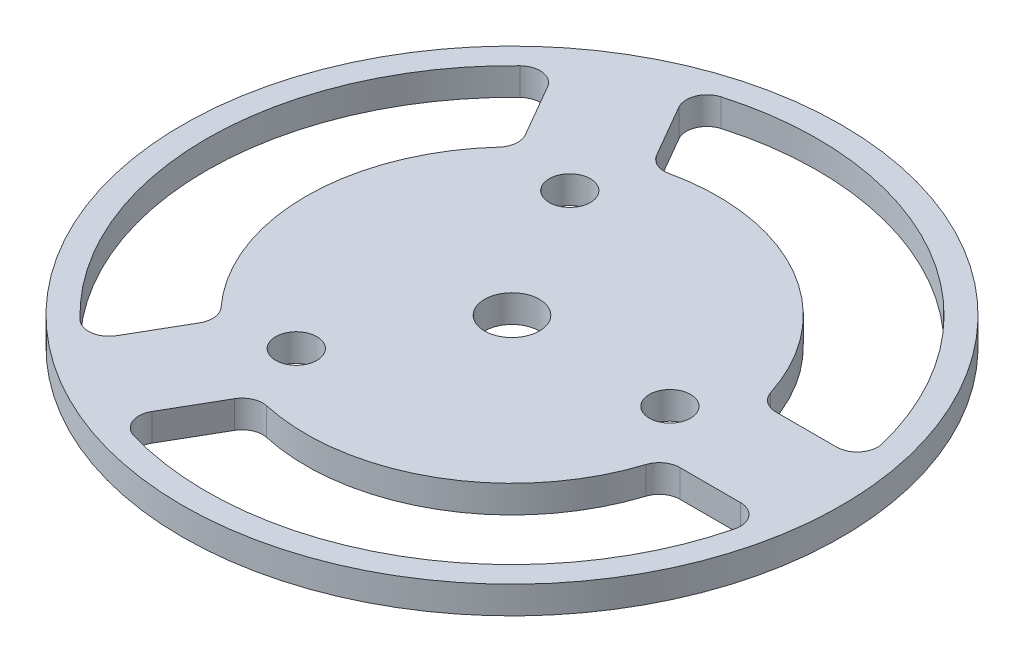
ISO-10303-21;
HEADER;
FILE_DESCRIPTION(('STEP AP214'),'2;1');
FILE_NAME('part.step','',(''),(''),'','','');
FILE_SCHEMA(('AUTOMOTIVE_DESIGN { 1 0 10303 214 1 1 1 1 }'));
ENDSEC;
DATA;
#1=APPLICATION_CONTEXT('core data for automotive mechanical design processes');
#2=APPLICATION_PROTOCOL_DEFINITION('international standard','automotive_design',2000,#1);
#3=PRODUCT_CONTEXT('',#1,'mechanical');
#4=PRODUCT('Part','Part','',(#3));
#5=PRODUCT_RELATED_PRODUCT_CATEGORY('part','',(#4));
#6=PRODUCT_DEFINITION_FORMATION('','',#4);
#7=PRODUCT_DEFINITION_CONTEXT('part definition',#1,'design');
#8=PRODUCT_DEFINITION('design','',#6,#7);
#9=PRODUCT_DEFINITION_SHAPE('','',#8);
#10=(LENGTH_UNIT() NAMED_UNIT(*) SI_UNIT(.MILLI.,.METRE.));
#11=(NAMED_UNIT(*) PLANE_ANGLE_UNIT() SI_UNIT($,.RADIAN.));
#12=(NAMED_UNIT(*) SI_UNIT($,.STERADIAN.) SOLID_ANGLE_UNIT());
#13=UNCERTAINTY_MEASURE_WITH_UNIT(LENGTH_MEASURE(1.E-05),#10,'distance_accuracy_value','');
#14=(GEOMETRIC_REPRESENTATION_CONTEXT(3) GLOBAL_UNCERTAINTY_ASSIGNED_CONTEXT((#13)) GLOBAL_UNIT_ASSIGNED_CONTEXT((#10,
#11,#12)) REPRESENTATION_CONTEXT('',''));
#15=CARTESIAN_POINT('',(0.,0.,0.));
#16=DIRECTION('',(0.,0.,1.));
#17=DIRECTION('',(1.,0.,0.));
#18=AXIS2_PLACEMENT_3D('',#15,#16,#17);
#19=CARTESIAN_POINT('',(0.,2.,0.));
#20=DIRECTION('',(0.,1.,0.));
#21=DIRECTION('',(0.,0.,1.));
#22=AXIS2_PLACEMENT_3D('',#19,#20,#21);
#23=PLANE('',#22);
#24=CARTESIAN_POINT('',(0.,2.,0.));
#25=DIRECTION('',(0.,1.,0.));
#26=DIRECTION('',(0.,0.,1.));
#27=AXIS2_PLACEMENT_3D('',#24,#25,#26);
#28=CIRCLE('',#27,22.25);
#29=CARTESIAN_POINT('',(21.5943835085545,2.,-5.36144578313253));
#30=VERTEX_POINT('',#29);
#31=CARTESIAN_POINT('',(-6.15404350507153,2.,-21.3820075890382));
#32=VERTEX_POINT('',#31);
#33=EDGE_CURVE('E482',#30,#32,#28,.T.);
#34=ORIENTED_EDGE('',*,*,#33,.F.);
#35=CARTESIAN_POINT('',(20.1385823731463,2.,-5.));
#36=DIRECTION('',(0.,1.,0.));
#37=DIRECTION('',(0.,0.,1.));
#38=AXIS2_PLACEMENT_3D('',#35,#36,#37);
#39=CIRCLE('',#38,1.5);
#40=CARTESIAN_POINT('',(20.1385823731463,2.,-3.5));
#41=VERTEX_POINT('',#40);
#42=EDGE_CURVE('E373',#30,#41,#39,.F.);
#43=ORIENTED_EDGE('',*,*,#42,.T.);
#44=DIRECTION('',(1.,0.,0.));
#45=VECTOR('',#44,1.);
#46=CARTESIAN_POINT('',(21.9729947890587,2.,-3.5));
#47=LINE('',#46,#45);
#48=CARTESIAN_POINT('',(15.7241851935164,2.,-3.5));
#49=VERTEX_POINT('',#48);
#50=EDGE_CURVE('E471',#49,#41,#47,.T.);
#51=ORIENTED_EDGE('',*,*,#50,.F.);
#52=CARTESIAN_POINT('',(15.7241851935164,2.,-5.));
#53=DIRECTION('',(0.,1.,0.));
#54=DIRECTION('',(0.,0.,1.));
#55=AXIS2_PLACEMENT_3D('',#52,#53,#54);
#56=CIRCLE('',#55,1.5);
#57=CARTESIAN_POINT('',(14.2947138122876,2.,-4.54545454545454));
#58=VERTEX_POINT('',#57);
#59=EDGE_CURVE('E391',#49,#58,#56,.F.);
#60=ORIENTED_EDGE('',*,*,#59,.T.);
#61=CARTESIAN_POINT('',(0.,2.,0.));
#62=DIRECTION('',(0.,-1.,0.));
#63=DIRECTION('',(0.,0.,1.));
#64=AXIS2_PLACEMENT_3D('',#61,#62,#63);
#65=CIRCLE('',#64,15.);
#66=CARTESIAN_POINT('',(-3.21087779803273,2.,-14.6523125739967));
#67=VERTEX_POINT('',#66);
#68=EDGE_CURVE('E490',#67,#58,#65,.T.);
#69=ORIENTED_EDGE('',*,*,#68,.F.);
#70=CARTESIAN_POINT('',(-3.53196557783601,2.,-16.1175438313963));
#71=DIRECTION('',(0.,1.,0.));
#72=DIRECTION('',(0.,0.,1.));
#73=AXIS2_PLACEMENT_3D('',#70,#71,#72);
#74=CIRCLE('',#73,1.5);
#75=CARTESIAN_POINT('',(-4.83100368351267,2.,-15.3675438313963));
#76=VERTEX_POINT('',#75);
#77=EDGE_CURVE('E385',#67,#76,#74,.F.);
#78=ORIENTED_EDGE('',*,*,#77,.T.);
#79=DIRECTION('',(0.5,0.,0.866025403784438));
#80=VECTOR('',#79,1.);
#81=CARTESIAN_POINT('',(-7.95540848128382,2.,-20.7791716845479));
#82=LINE('',#81,#80);
#83=CARTESIAN_POINT('',(-7.03820227332764,2.,-19.1905239313502));
#84=VERTEX_POINT('',#83);
#85=EDGE_CURVE('E486',#84,#76,#82,.T.);
#86=ORIENTED_EDGE('',*,*,#85,.F.);
#87=CARTESIAN_POINT('',(-5.73916416765098,2.,-19.9405239313502));
#88=DIRECTION('',(0.,1.,0.));
#89=DIRECTION('',(0.,0.,1.));
#90=AXIS2_PLACEMENT_3D('',#87,#88,#89);
#91=CIRCLE('',#90,1.5);
#92=EDGE_CURVE('E361',#84,#32,#91,.F.);
#93=ORIENTED_EDGE('',*,*,#92,.T.);
#94=EDGE_LOOP('',(#34,#43,#51,#60,#69,#78,#86,#93));
#95=FACE_BOUND('',#94,.T.);
#96=CARTESIAN_POINT('',(0.,2.,0.));
#97=DIRECTION('',(0.,1.,0.));
#98=DIRECTION('',(0.,0.,1.));
#99=AXIS2_PLACEMENT_3D('',#96,#97,#98);
#100=CIRCLE('',#99,22.25);
#101=CARTESIAN_POINT('',(-15.440340003483,2.,-16.0205618059057));
#102=VERTEX_POINT('',#101);
#103=CARTESIAN_POINT('',(-15.440340003483,2.,16.0205618059057));
#104=VERTEX_POINT('',#103);
#105=EDGE_CURVE('E424',#102,#104,#100,.T.);
#106=ORIENTED_EDGE('',*,*,#105,.F.);
#107=CARTESIAN_POINT('',(-14.3994182054954,2.,-14.9405239313502));
#108=DIRECTION('',(0.,1.,0.));
#109=DIRECTION('',(0.,0.,1.));
#110=AXIS2_PLACEMENT_3D('',#107,#108,#109);
#111=CIRCLE('',#110,1.5);
#112=CARTESIAN_POINT('',(-13.1003800998187,2.,-15.6905239313502));
#113=VERTEX_POINT('',#112);
#114=EDGE_CURVE('E48',#102,#113,#111,.F.);
#115=ORIENTED_EDGE('',*,*,#114,.T.);
#116=DIRECTION('',(-0.499999999999998,0.,-0.86602540378444));
#117=VECTOR('',#116,1.);
#118=CARTESIAN_POINT('',(-14.0175863077749,2.,-17.2791716845479));
#119=LINE('',#118,#117);
#120=CARTESIAN_POINT('',(-10.8931815100037,2.,-11.8675438313963));
#121=VERTEX_POINT('',#120);
#122=EDGE_CURVE('E422',#121,#113,#119,.T.);
#123=ORIENTED_EDGE('',*,*,#122,.F.);
#124=CARTESIAN_POINT('',(-12.1922196156804,2.,-11.1175438313963));
#125=DIRECTION('',(0.,1.,0.));
#126=DIRECTION('',(0.,0.,1.));
#127=AXIS2_PLACEMENT_3D('',#124,#125,#126);
#128=CIRCLE('',#127,1.5);
#129=CARTESIAN_POINT('',(-11.0838360142549,2.,-10.1068580285421));
#130=VERTEX_POINT('',#129);
#131=EDGE_CURVE('E414',#121,#130,#128,.F.);
#132=ORIENTED_EDGE('',*,*,#131,.T.);
#133=CARTESIAN_POINT('',(0.,2.,0.));
#134=DIRECTION('',(0.,-1.,0.));
#135=DIRECTION('',(0.,0.,1.));
#136=AXIS2_PLACEMENT_3D('',#133,#134,#135);
#137=CIRCLE('',#136,15.);
#138=CARTESIAN_POINT('',(-11.0838360142549,2.,10.1068580285421));
#139=VERTEX_POINT('',#138);
#140=EDGE_CURVE('E431',#139,#130,#137,.T.);
#141=ORIENTED_EDGE('',*,*,#140,.F.);
#142=CARTESIAN_POINT('',(-12.1922196156804,2.,11.1175438313963));
#143=DIRECTION('',(0.,1.,0.));
#144=DIRECTION('',(0.,0.,1.));
#145=AXIS2_PLACEMENT_3D('',#142,#143,#144);
#146=CIRCLE('',#145,1.5);
#147=CARTESIAN_POINT('',(-10.8931815100037,2.,11.8675438313963));
#148=VERTEX_POINT('',#147);
#149=EDGE_CURVE('E408',#139,#148,#146,.F.);
#150=ORIENTED_EDGE('',*,*,#149,.T.);
#151=DIRECTION('',(0.499999999999999,0.,-0.866025403784439));
#152=VECTOR('',#151,1.);
#153=CARTESIAN_POINT('',(-14.0175863077749,2.,17.2791716845479));
#154=LINE('',#153,#152);
#155=CARTESIAN_POINT('',(-13.1003800998187,2.,15.6905239313502));
#156=VERTEX_POINT('',#155);
#157=EDGE_CURVE('E458',#156,#148,#154,.T.);
#158=ORIENTED_EDGE('',*,*,#157,.F.);
#159=CARTESIAN_POINT('',(-14.3994182054954,2.,14.9405239313502));
#160=DIRECTION('',(0.,1.,0.));
#161=DIRECTION('',(0.,0.,1.));
#162=AXIS2_PLACEMENT_3D('',#159,#160,#161);
#163=CIRCLE('',#162,1.5);
#164=EDGE_CURVE('E379',#156,#104,#163,.F.);
#165=ORIENTED_EDGE('',*,*,#164,.T.);
#166=EDGE_LOOP('',(#106,#115,#123,#132,#141,#150,#158,#165));
#167=FACE_BOUND('',#166,.T.);
#168=CARTESIAN_POINT('',(0.,2.,0.));
#169=DIRECTION('',(0.,1.,0.));
#170=DIRECTION('',(0.,0.,1.));
#171=AXIS2_PLACEMENT_3D('',#168,#169,#170);
#172=CIRCLE('',#171,22.25);
#173=CARTESIAN_POINT('',(-6.15404350507152,2.,21.3820075890382));
#174=VERTEX_POINT('',#173);
#175=CARTESIAN_POINT('',(21.5943835085545,2.,5.36144578313253));
#176=VERTEX_POINT('',#175);
#177=EDGE_CURVE('E455',#174,#176,#172,.T.);
#178=ORIENTED_EDGE('',*,*,#177,.F.);
#179=CARTESIAN_POINT('',(-5.73916416765096,2.,19.9405239313502));
#180=DIRECTION('',(0.,1.,0.));
#181=DIRECTION('',(0.,0.,1.));
#182=AXIS2_PLACEMENT_3D('',#179,#180,#181);
#183=CIRCLE('',#182,1.5);
#184=CARTESIAN_POINT('',(-7.03820227332762,2.,19.1905239313502));
#185=VERTEX_POINT('',#184);
#186=EDGE_CURVE('E230',#174,#185,#183,.F.);
#187=ORIENTED_EDGE('',*,*,#186,.T.);
#188=DIRECTION('',(-0.5,0.,0.866025403784439));
#189=VECTOR('',#188,1.);
#190=CARTESIAN_POINT('',(-7.9554084812838,2.,20.7791716845479));
#191=LINE('',#190,#189);
#192=CARTESIAN_POINT('',(-4.83100368351266,2.,15.3675438313963));
#193=VERTEX_POINT('',#192);
#194=EDGE_CURVE('E220',#193,#185,#191,.T.);
#195=ORIENTED_EDGE('',*,*,#194,.F.);
#196=CARTESIAN_POINT('',(-3.531965577836,2.,16.1175438313963));
#197=DIRECTION('',(0.,1.,0.));
#198=DIRECTION('',(0.,0.,1.));
#199=AXIS2_PLACEMENT_3D('',#196,#197,#198);
#200=CIRCLE('',#199,1.5);
#201=CARTESIAN_POINT('',(-3.21087779803272,2.,14.6523125739967));
#202=VERTEX_POINT('',#201);
#203=EDGE_CURVE('E202',#193,#202,#200,.F.);
#204=ORIENTED_EDGE('',*,*,#203,.T.);
#205=CARTESIAN_POINT('',(0.,2.,0.));
#206=DIRECTION('',(0.,-1.,0.));
#207=DIRECTION('',(0.,0.,1.));
#208=AXIS2_PLACEMENT_3D('',#205,#206,#207);
#209=CIRCLE('',#208,15.);
#210=CARTESIAN_POINT('',(14.2947138122876,2.,4.54545454545454));
#211=VERTEX_POINT('',#210);
#212=EDGE_CURVE('E233',#211,#202,#209,.T.);
#213=ORIENTED_EDGE('',*,*,#212,.F.);
#214=CARTESIAN_POINT('',(15.7241851935164,2.,5.));
#215=DIRECTION('',(0.,1.,0.));
#216=DIRECTION('',(0.,0.,1.));
#217=AXIS2_PLACEMENT_3D('',#214,#215,#216);
#218=CIRCLE('',#217,1.5);
#219=CARTESIAN_POINT('',(15.7241851935164,2.,3.5));
#220=VERTEX_POINT('',#219);
#221=EDGE_CURVE('E367',#211,#220,#218,.F.);
#222=ORIENTED_EDGE('',*,*,#221,.T.);
#223=DIRECTION('',(-1.,0.,0.));
#224=VECTOR('',#223,1.);
#225=CARTESIAN_POINT('',(21.9729947890587,2.,3.5));
#226=LINE('',#225,#224);
#227=CARTESIAN_POINT('',(20.1385823731463,2.,3.5));
#228=VERTEX_POINT('',#227);
#229=EDGE_CURVE('E240',#228,#220,#226,.T.);
#230=ORIENTED_EDGE('',*,*,#229,.F.);
#231=CARTESIAN_POINT('',(20.1385823731463,2.,5.));
#232=DIRECTION('',(0.,1.,0.));
#233=DIRECTION('',(0.,0.,1.));
#234=AXIS2_PLACEMENT_3D('',#231,#232,#233);
#235=CIRCLE('',#234,1.5);
#236=EDGE_CURVE('E402',#228,#176,#235,.F.);
#237=ORIENTED_EDGE('',*,*,#236,.T.);
#238=EDGE_LOOP('',(#178,#187,#195,#204,#213,#222,#230,#237));
#239=FACE_BOUND('',#238,.T.);
#240=CARTESIAN_POINT('',(-5.75000000000005,2.,9.95929214352102));
#241=DIRECTION('',(0.,1.,0.));
#242=DIRECTION('',(0.,0.,1.));
#243=AXIS2_PLACEMENT_3D('',#240,#241,#242);
#244=CIRCLE('',#243,1.5);
#245=CARTESIAN_POINT('',(-5.75000000000005,2.,11.459292143521));
#246=VERTEX_POINT('',#245);
#247=EDGE_CURVE('E253',#246,#246,#244,.T.);
#248=ORIENTED_EDGE('',*,*,#247,.F.);
#249=EDGE_LOOP('',(#248));
#250=FACE_BOUND('',#249,.T.);
#251=CARTESIAN_POINT('',(0.,2.,0.));
#252=DIRECTION('',(0.,1.,0.));
#253=DIRECTION('',(0.,0.,1.));
#254=AXIS2_PLACEMENT_3D('',#251,#252,#253);
#255=CIRCLE('',#254,2.);
#256=CARTESIAN_POINT('',(0.,2.,2.));
#257=VERTEX_POINT('',#256);
#258=EDGE_CURVE('E269',#257,#257,#255,.T.);
#259=ORIENTED_EDGE('',*,*,#258,.F.);
#260=EDGE_LOOP('',(#259));
#261=FACE_BOUND('',#260,.T.);
#262=CARTESIAN_POINT('',(0.,2.,0.));
#263=DIRECTION('',(0.,1.,0.));
#264=DIRECTION('',(0.,0.,1.));
#265=AXIS2_PLACEMENT_3D('',#262,#263,#264);
#266=CIRCLE('',#265,24.);
#267=CARTESIAN_POINT('',(0.,2.,24.));
#268=VERTEX_POINT('',#267);
#269=EDGE_CURVE('E277',#268,#268,#266,.T.);
#270=ORIENTED_EDGE('',*,*,#269,.T.);
#271=EDGE_LOOP('',(#270));
#272=FACE_BOUND('',#271,.T.);
#273=CARTESIAN_POINT('',(11.5,2.,0.));
#274=DIRECTION('',(0.,1.,0.));
#275=DIRECTION('',(0.,0.,1.));
#276=AXIS2_PLACEMENT_3D('',#273,#274,#275);
#277=CIRCLE('',#276,1.5);
#278=CARTESIAN_POINT('',(11.5,2.,1.5));
#279=VERTEX_POINT('',#278);
#280=EDGE_CURVE('E261',#279,#279,#277,.T.);
#281=ORIENTED_EDGE('',*,*,#280,.F.);
#282=EDGE_LOOP('',(#281));
#283=FACE_BOUND('',#282,.T.);
#284=CARTESIAN_POINT('',(-5.74999999999991,2.,-9.95929214352109));
#285=DIRECTION('',(0.,1.,0.));
#286=DIRECTION('',(0.,0.,1.));
#287=AXIS2_PLACEMENT_3D('',#284,#285,#286);
#288=CIRCLE('',#287,1.5);
#289=CARTESIAN_POINT('',(-5.74999999999991,2.,-8.4592921435211));
#290=VERTEX_POINT('',#289);
#291=EDGE_CURVE('E244',#290,#290,#288,.T.);
#292=ORIENTED_EDGE('',*,*,#291,.F.);
#293=EDGE_LOOP('',(#292));
#294=FACE_BOUND('',#293,.T.);
#295=ADVANCED_FACE('F39',(#95,#167,#239,#250,#261,#272,#283,#294),#23,.T.);
#296=CARTESIAN_POINT('',(0.,0.,0.));
#297=DIRECTION('',(0.,1.,0.));
#298=DIRECTION('',(0.,0.,1.));
#299=AXIS2_PLACEMENT_3D('',#296,#297,#298);
#300=PLANE('',#299);
#301=CARTESIAN_POINT('',(0.,0.,0.));
#302=DIRECTION('',(0.,-1.,0.));
#303=DIRECTION('',(0.,0.,1.));
#304=AXIS2_PLACEMENT_3D('',#301,#302,#303);
#305=CIRCLE('',#304,15.);
#306=CARTESIAN_POINT('',(-3.21087779803273,0.,-14.6523125739967));
#307=VERTEX_POINT('',#306);
#308=CARTESIAN_POINT('',(14.2947138122876,0.,-4.54545454545454));
#309=VERTEX_POINT('',#308);
#310=EDGE_CURVE('E475',#307,#309,#305,.T.);
#311=ORIENTED_EDGE('',*,*,#310,.T.);
#312=CARTESIAN_POINT('',(15.7241851935164,0.,-5.));
#313=DIRECTION('',(0.,1.,0.));
#314=DIRECTION('',(0.,0.,1.));
#315=AXIS2_PLACEMENT_3D('',#312,#313,#314);
#316=CIRCLE('',#315,1.5);
#317=CARTESIAN_POINT('',(15.7241851935164,0.,-3.5));
#318=VERTEX_POINT('',#317);
#319=EDGE_CURVE('E394',#309,#318,#316,.T.);
#320=ORIENTED_EDGE('',*,*,#319,.T.);
#321=DIRECTION('',(1.,0.,0.));
#322=VECTOR('',#321,1.);
#323=CARTESIAN_POINT('',(21.9729947890587,0.,-3.5));
#324=LINE('',#323,#322);
#325=CARTESIAN_POINT('',(20.1385823731463,0.,-3.5));
#326=VERTEX_POINT('',#325);
#327=EDGE_CURVE('E459',#318,#326,#324,.T.);
#328=ORIENTED_EDGE('',*,*,#327,.T.);
#329=CARTESIAN_POINT('',(20.1385823731463,0.,-5.));
#330=DIRECTION('',(0.,1.,0.));
#331=DIRECTION('',(0.,0.,1.));
#332=AXIS2_PLACEMENT_3D('',#329,#330,#331);
#333=CIRCLE('',#332,1.5);
#334=CARTESIAN_POINT('',(21.5943835085545,0.,-5.36144578313253));
#335=VERTEX_POINT('',#334);
#336=EDGE_CURVE('E376',#326,#335,#333,.T.);
#337=ORIENTED_EDGE('',*,*,#336,.T.);
#338=CARTESIAN_POINT('',(0.,0.,0.));
#339=DIRECTION('',(0.,1.,0.));
#340=DIRECTION('',(0.,0.,1.));
#341=AXIS2_PLACEMENT_3D('',#338,#339,#340);
#342=CIRCLE('',#341,22.25);
#343=CARTESIAN_POINT('',(-6.15404350507153,0.,-21.3820075890382));
#344=VERTEX_POINT('',#343);
#345=EDGE_CURVE('E466',#335,#344,#342,.T.);
#346=ORIENTED_EDGE('',*,*,#345,.T.);
#347=CARTESIAN_POINT('',(-5.73916416765098,0.,-19.9405239313502));
#348=DIRECTION('',(0.,1.,0.));
#349=DIRECTION('',(0.,0.,1.));
#350=AXIS2_PLACEMENT_3D('',#347,#348,#349);
#351=CIRCLE('',#350,1.5);
#352=CARTESIAN_POINT('',(-7.03820227332764,0.,-19.1905239313502));
#353=VERTEX_POINT('',#352);
#354=EDGE_CURVE('E364',#344,#353,#351,.T.);
#355=ORIENTED_EDGE('',*,*,#354,.T.);
#356=DIRECTION('',(0.5,0.,0.866025403784438));
#357=VECTOR('',#356,1.);
#358=CARTESIAN_POINT('',(-7.95540848128382,0.,-20.7791716845479));
#359=LINE('',#358,#357);
#360=CARTESIAN_POINT('',(-4.83100368351267,0.,-15.3675438313963));
#361=VERTEX_POINT('',#360);
#362=EDGE_CURVE('E470',#353,#361,#359,.T.);
#363=ORIENTED_EDGE('',*,*,#362,.T.);
#364=CARTESIAN_POINT('',(-3.53196557783601,0.,-16.1175438313963));
#365=DIRECTION('',(0.,1.,0.));
#366=DIRECTION('',(0.,0.,1.));
#367=AXIS2_PLACEMENT_3D('',#364,#365,#366);
#368=CIRCLE('',#367,1.5);
#369=EDGE_CURVE('E388',#361,#307,#368,.T.);
#370=ORIENTED_EDGE('',*,*,#369,.T.);
#371=EDGE_LOOP('',(#311,#320,#328,#337,#346,#355,#363,#370));
#372=FACE_BOUND('',#371,.T.);
#373=CARTESIAN_POINT('',(0.,0.,0.));
#374=DIRECTION('',(0.,-1.,0.));
#375=DIRECTION('',(0.,0.,1.));
#376=AXIS2_PLACEMENT_3D('',#373,#374,#375);
#377=CIRCLE('',#376,15.);
#378=CARTESIAN_POINT('',(-11.0838360142549,0.,10.1068580285421));
#379=VERTEX_POINT('',#378);
#380=CARTESIAN_POINT('',(-11.0838360142549,0.,-10.1068580285421));
#381=VERTEX_POINT('',#380);
#382=EDGE_CURVE('E448',#379,#381,#377,.T.);
#383=ORIENTED_EDGE('',*,*,#382,.T.);
#384=CARTESIAN_POINT('',(-12.1922196156804,0.,-11.1175438313963));
#385=DIRECTION('',(0.,1.,0.));
#386=DIRECTION('',(0.,0.,1.));
#387=AXIS2_PLACEMENT_3D('',#384,#385,#386);
#388=CIRCLE('',#387,1.5);
#389=CARTESIAN_POINT('',(-10.8931815100037,0.,-11.8675438313963));
#390=VERTEX_POINT('',#389);
#391=EDGE_CURVE('E62',#381,#390,#388,.T.);
#392=ORIENTED_EDGE('',*,*,#391,.T.);
#393=DIRECTION('',(-0.499999999999998,0.,-0.86602540378444));
#394=VECTOR('',#393,1.);
#395=CARTESIAN_POINT('',(-14.0175863077749,0.,-17.2791716845479));
#396=LINE('',#395,#394);
#397=CARTESIAN_POINT('',(-13.1003800998187,0.,-15.6905239313502));
#398=VERTEX_POINT('',#397);
#399=EDGE_CURVE('E439',#390,#398,#396,.T.);
#400=ORIENTED_EDGE('',*,*,#399,.T.);
#401=CARTESIAN_POINT('',(-14.3994182054954,0.,-14.9405239313502));
#402=DIRECTION('',(0.,1.,0.));
#403=DIRECTION('',(0.,0.,1.));
#404=AXIS2_PLACEMENT_3D('',#401,#402,#403);
#405=CIRCLE('',#404,1.5);
#406=CARTESIAN_POINT('',(-15.440340003483,0.,-16.0205618059057));
#407=VERTEX_POINT('',#406);
#408=EDGE_CURVE('E11',#398,#407,#405,.T.);
#409=ORIENTED_EDGE('',*,*,#408,.T.);
#410=CARTESIAN_POINT('',(0.,0.,0.));
#411=DIRECTION('',(0.,1.,0.));
#412=DIRECTION('',(0.,0.,1.));
#413=AXIS2_PLACEMENT_3D('',#410,#411,#412);
#414=CIRCLE('',#413,22.25);
#415=CARTESIAN_POINT('',(-15.440340003483,0.,16.0205618059057));
#416=VERTEX_POINT('',#415);
#417=EDGE_CURVE('E430',#407,#416,#414,.T.);
#418=ORIENTED_EDGE('',*,*,#417,.T.);
#419=CARTESIAN_POINT('',(-14.3994182054954,0.,14.9405239313502));
#420=DIRECTION('',(0.,1.,0.));
#421=DIRECTION('',(0.,0.,1.));
#422=AXIS2_PLACEMENT_3D('',#419,#420,#421);
#423=CIRCLE('',#422,1.5);
#424=CARTESIAN_POINT('',(-13.1003800998187,0.,15.6905239313502));
#425=VERTEX_POINT('',#424);
#426=EDGE_CURVE('E382',#416,#425,#423,.T.);
#427=ORIENTED_EDGE('',*,*,#426,.T.);
#428=DIRECTION('',(0.499999999999999,0.,-0.866025403784439));
#429=VECTOR('',#428,1.);
#430=CARTESIAN_POINT('',(-14.0175863077749,0.,17.2791716845479));
#431=LINE('',#430,#429);
#432=CARTESIAN_POINT('',(-10.8931815100037,0.,11.8675438313963));
#433=VERTEX_POINT('',#432);
#434=EDGE_CURVE('E444',#425,#433,#431,.T.);
#435=ORIENTED_EDGE('',*,*,#434,.T.);
#436=CARTESIAN_POINT('',(-12.1922196156804,0.,11.1175438313963));
#437=DIRECTION('',(0.,1.,0.));
#438=DIRECTION('',(0.,0.,1.));
#439=AXIS2_PLACEMENT_3D('',#436,#437,#438);
#440=CIRCLE('',#439,1.5);
#441=EDGE_CURVE('E411',#433,#379,#440,.T.);
#442=ORIENTED_EDGE('',*,*,#441,.T.);
#443=EDGE_LOOP('',(#383,#392,#400,#409,#418,#427,#435,#442));
#444=FACE_BOUND('',#443,.T.);
#445=CARTESIAN_POINT('',(0.,0.,0.));
#446=DIRECTION('',(0.,-1.,0.));
#447=DIRECTION('',(0.,0.,1.));
#448=AXIS2_PLACEMENT_3D('',#445,#446,#447);
#449=CIRCLE('',#448,15.);
#450=CARTESIAN_POINT('',(14.2947138122876,0.,4.54545454545454));
#451=VERTEX_POINT('',#450);
#452=CARTESIAN_POINT('',(-3.21087779803272,0.,14.6523125739967));
#453=VERTEX_POINT('',#452);
#454=EDGE_CURVE('E500',#451,#453,#449,.T.);
#455=ORIENTED_EDGE('',*,*,#454,.T.);
#456=CARTESIAN_POINT('',(-3.531965577836,0.,16.1175438313963));
#457=DIRECTION('',(0.,1.,0.));
#458=DIRECTION('',(0.,0.,1.));
#459=AXIS2_PLACEMENT_3D('',#456,#457,#458);
#460=CIRCLE('',#459,1.5);
#461=CARTESIAN_POINT('',(-4.83100368351266,0.,15.3675438313963));
#462=VERTEX_POINT('',#461);
#463=EDGE_CURVE('E213',#453,#462,#460,.T.);
#464=ORIENTED_EDGE('',*,*,#463,.T.);
#465=DIRECTION('',(-0.5,0.,0.866025403784439));
#466=VECTOR('',#465,1.);
#467=CARTESIAN_POINT('',(-7.9554084812838,0.,20.7791716845479));
#468=LINE('',#467,#466);
#469=CARTESIAN_POINT('',(-7.03820227332762,0.,19.1905239313502));
#470=VERTEX_POINT('',#469);
#471=EDGE_CURVE('E223',#462,#470,#468,.T.);
#472=ORIENTED_EDGE('',*,*,#471,.T.);
#473=CARTESIAN_POINT('',(-5.73916416765096,0.,19.9405239313502));
#474=DIRECTION('',(0.,1.,0.));
#475=DIRECTION('',(0.,0.,1.));
#476=AXIS2_PLACEMENT_3D('',#473,#474,#475);
#477=CIRCLE('',#476,1.5);
#478=CARTESIAN_POINT('',(-6.15404350507152,0.,21.3820075890382));
#479=VERTEX_POINT('',#478);
#480=EDGE_CURVE('E399',#470,#479,#477,.T.);
#481=ORIENTED_EDGE('',*,*,#480,.T.);
#482=CARTESIAN_POINT('',(0.,0.,0.));
#483=DIRECTION('',(0.,1.,0.));
#484=DIRECTION('',(0.,0.,1.));
#485=AXIS2_PLACEMENT_3D('',#482,#483,#484);
#486=CIRCLE('',#485,22.25);
#487=CARTESIAN_POINT('',(21.5943835085545,0.,5.36144578313253));
#488=VERTEX_POINT('',#487);
#489=EDGE_CURVE('E232',#479,#488,#486,.T.);
#490=ORIENTED_EDGE('',*,*,#489,.T.);
#491=CARTESIAN_POINT('',(20.1385823731463,0.,5.));
#492=DIRECTION('',(0.,1.,0.));
#493=DIRECTION('',(0.,0.,1.));
#494=AXIS2_PLACEMENT_3D('',#491,#492,#493);
#495=CIRCLE('',#494,1.5);
#496=CARTESIAN_POINT('',(20.1385823731463,0.,3.5));
#497=VERTEX_POINT('',#496);
#498=EDGE_CURVE('E405',#488,#497,#495,.T.);
#499=ORIENTED_EDGE('',*,*,#498,.T.);
#500=DIRECTION('',(-1.,0.,0.));
#501=VECTOR('',#500,1.);
#502=CARTESIAN_POINT('',(21.9729947890587,0.,3.5));
#503=LINE('',#502,#501);
#504=CARTESIAN_POINT('',(15.7241851935164,0.,3.5));
#505=VERTEX_POINT('',#504);
#506=EDGE_CURVE('E238',#497,#505,#503,.T.);
#507=ORIENTED_EDGE('',*,*,#506,.T.);
#508=CARTESIAN_POINT('',(15.7241851935164,0.,5.));
#509=DIRECTION('',(0.,1.,0.));
#510=DIRECTION('',(0.,0.,1.));
#511=AXIS2_PLACEMENT_3D('',#508,#509,#510);
#512=CIRCLE('',#511,1.5);
#513=EDGE_CURVE('E370',#505,#451,#512,.T.);
#514=ORIENTED_EDGE('',*,*,#513,.T.);
#515=EDGE_LOOP('',(#455,#464,#472,#481,#490,#499,#507,#514));
#516=FACE_BOUND('',#515,.T.);
#517=CARTESIAN_POINT('',(0.,0.,0.));
#518=DIRECTION('',(0.,1.,0.));
#519=DIRECTION('',(0.,0.,1.));
#520=AXIS2_PLACEMENT_3D('',#517,#518,#519);
#521=CIRCLE('',#520,24.);
#522=CARTESIAN_POINT('',(0.,0.,24.));
#523=VERTEX_POINT('',#522);
#524=EDGE_CURVE('E273',#523,#523,#521,.T.);
#525=ORIENTED_EDGE('',*,*,#524,.F.);
#526=EDGE_LOOP('',(#525));
#527=FACE_BOUND('',#526,.T.);
#528=CARTESIAN_POINT('',(0.,0.,0.));
#529=DIRECTION('',(0.,1.,0.));
#530=DIRECTION('',(0.,0.,1.));
#531=AXIS2_PLACEMENT_3D('',#528,#529,#530);
#532=CIRCLE('',#531,2.);
#533=CARTESIAN_POINT('',(0.,0.,2.));
#534=VERTEX_POINT('',#533);
#535=EDGE_CURVE('E265',#534,#534,#532,.T.);
#536=ORIENTED_EDGE('',*,*,#535,.T.);
#537=EDGE_LOOP('',(#536));
#538=FACE_BOUND('',#537,.T.);
#539=CARTESIAN_POINT('',(11.5,0.,0.));
#540=DIRECTION('',(0.,1.,0.));
#541=DIRECTION('',(0.,0.,1.));
#542=AXIS2_PLACEMENT_3D('',#539,#540,#541);
#543=CIRCLE('',#542,1.5);
#544=CARTESIAN_POINT('',(11.5,0.,1.5));
#545=VERTEX_POINT('',#544);
#546=EDGE_CURVE('E257',#545,#545,#543,.T.);
#547=ORIENTED_EDGE('',*,*,#546,.T.);
#548=EDGE_LOOP('',(#547));
#549=FACE_BOUND('',#548,.T.);
#550=CARTESIAN_POINT('',(-5.75000000000005,0.,9.95929214352102));
#551=DIRECTION('',(0.,1.,0.));
#552=DIRECTION('',(0.,0.,1.));
#553=AXIS2_PLACEMENT_3D('',#550,#551,#552);
#554=CIRCLE('',#553,1.5);
#555=CARTESIAN_POINT('',(-5.75000000000005,0.,11.459292143521));
#556=VERTEX_POINT('',#555);
#557=EDGE_CURVE('E248',#556,#556,#554,.T.);
#558=ORIENTED_EDGE('',*,*,#557,.T.);
#559=EDGE_LOOP('',(#558));
#560=FACE_BOUND('',#559,.T.);
#561=CARTESIAN_POINT('',(-5.74999999999991,0.,-9.95929214352109));
#562=DIRECTION('',(0.,1.,0.));
#563=DIRECTION('',(0.,0.,1.));
#564=AXIS2_PLACEMENT_3D('',#561,#562,#563);
#565=CIRCLE('',#564,1.5);
#566=CARTESIAN_POINT('',(-5.74999999999991,0.,-8.4592921435211));
#567=VERTEX_POINT('',#566);
#568=EDGE_CURVE('E249',#567,#567,#565,.T.);
#569=ORIENTED_EDGE('',*,*,#568,.T.);
#570=EDGE_LOOP('',(#569));
#571=FACE_BOUND('',#570,.T.);
#572=ADVANCED_FACE('F436',(#372,#444,#516,#527,#538,#549,#560,#571),#300,.F.);
#573=CARTESIAN_POINT('',(0.,2.,0.));
#574=DIRECTION('',(0.,-1.,0.));
#575=DIRECTION('',(0.,0.,-1.));
#576=AXIS2_PLACEMENT_3D('',#573,#574,#575);
#577=CYLINDRICAL_SURFACE('',#576,24.);
#578=ORIENTED_EDGE('',*,*,#269,.F.);
#579=EDGE_LOOP('',(#578));
#580=FACE_BOUND('',#579,.T.);
#581=ORIENTED_EDGE('',*,*,#524,.T.);
#582=EDGE_LOOP('',(#581));
#583=FACE_BOUND('',#582,.T.);
#584=ADVANCED_FACE('F539',(#580,#583),#577,.T.);
#585=CARTESIAN_POINT('',(0.,2.,0.));
#586=DIRECTION('',(0.,-1.,0.));
#587=DIRECTION('',(0.,0.,-1.));
#588=AXIS2_PLACEMENT_3D('',#585,#586,#587);
#589=CYLINDRICAL_SURFACE('',#588,2.);
#590=ORIENTED_EDGE('',*,*,#258,.T.);
#591=EDGE_LOOP('',(#590));
#592=FACE_BOUND('',#591,.T.);
#593=ORIENTED_EDGE('',*,*,#535,.F.);
#594=EDGE_LOOP('',(#593));
#595=FACE_BOUND('',#594,.T.);
#596=ADVANCED_FACE('F544',(#592,#595),#589,.F.);
#597=CARTESIAN_POINT('',(11.5,2.,0.));
#598=DIRECTION('',(0.,-1.,0.));
#599=DIRECTION('',(0.,0.,-1.));
#600=AXIS2_PLACEMENT_3D('',#597,#598,#599);
#601=CYLINDRICAL_SURFACE('',#600,1.5);
#602=ORIENTED_EDGE('',*,*,#280,.T.);
#603=EDGE_LOOP('',(#602));
#604=FACE_BOUND('',#603,.T.);
#605=ORIENTED_EDGE('',*,*,#546,.F.);
#606=EDGE_LOOP('',(#605));
#607=FACE_BOUND('',#606,.T.);
#608=ADVANCED_FACE('F799',(#604,#607),#601,.F.);
#609=CARTESIAN_POINT('',(-5.75000000000005,2.,9.95929214352102));
#610=DIRECTION('',(0.,-1.,0.));
#611=DIRECTION('',(0.,0.,-1.));
#612=AXIS2_PLACEMENT_3D('',#609,#610,#611);
#613=CYLINDRICAL_SURFACE('',#612,1.5);
#614=ORIENTED_EDGE('',*,*,#247,.T.);
#615=EDGE_LOOP('',(#614));
#616=FACE_BOUND('',#615,.T.);
#617=ORIENTED_EDGE('',*,*,#557,.F.);
#618=EDGE_LOOP('',(#617));
#619=FACE_BOUND('',#618,.T.);
#620=ADVANCED_FACE('F790',(#616,#619),#613,.F.);
#621=CARTESIAN_POINT('',(-5.74999999999991,2.,-9.95929214352109));
#622=DIRECTION('',(0.,-1.,0.));
#623=DIRECTION('',(0.,0.,-1.));
#624=AXIS2_PLACEMENT_3D('',#621,#622,#623);
#625=CYLINDRICAL_SURFACE('',#624,1.5);
#626=ORIENTED_EDGE('',*,*,#291,.T.);
#627=EDGE_LOOP('',(#626));
#628=FACE_BOUND('',#627,.T.);
#629=ORIENTED_EDGE('',*,*,#568,.F.);
#630=EDGE_LOOP('',(#629));
#631=FACE_BOUND('',#630,.T.);
#632=ADVANCED_FACE('F780',(#628,#631),#625,.F.);
#633=CARTESIAN_POINT('',(0.,0.,0.));
#634=DIRECTION('',(0.,1.,0.));
#635=DIRECTION('',(0.,0.,1.));
#636=AXIS2_PLACEMENT_3D('',#633,#634,#635);
#637=CYLINDRICAL_SURFACE('',#636,22.25);
#638=ORIENTED_EDGE('',*,*,#489,.F.);
#639=DIRECTION('',(0.,1.,0.));
#640=VECTOR('',#639,1.);
#641=CARTESIAN_POINT('',(-6.15404350507151,0.,21.3820075890382));
#642=LINE('',#641,#640);
#643=EDGE_CURVE('E343',#479,#174,#642,.T.);
#644=ORIENTED_EDGE('',*,*,#643,.T.);
#645=ORIENTED_EDGE('',*,*,#177,.T.);
#646=DIRECTION('',(0.,1.,0.));
#647=VECTOR('',#646,1.);
#648=CARTESIAN_POINT('',(21.5943835085545,0.,5.36144578313253));
#649=LINE('',#648,#647);
#650=EDGE_CURVE('E340',#176,#488,#649,.F.);
#651=ORIENTED_EDGE('',*,*,#650,.T.);
#652=EDGE_LOOP('',(#638,#644,#645,#651));
#653=FACE_BOUND('',#652,.T.);
#654=ADVANCED_FACE('F531',(#653),#637,.F.);
#655=CARTESIAN_POINT('',(-7.9554084812838,0.,20.7791716845479));
#656=DIRECTION('',(-0.866025403784439,0.,-0.5));
#657=DIRECTION('',(-0.5,0.,0.866025403784439));
#658=AXIS2_PLACEMENT_3D('',#655,#656,#657);
#659=PLANE('',#658);
#660=ORIENTED_EDGE('',*,*,#471,.F.);
#661=DIRECTION('',(0.,-1.,0.));
#662=VECTOR('',#661,1.);
#663=CARTESIAN_POINT('',(-4.83100368351266,2.,15.3675438313963));
#664=LINE('',#663,#662);
#665=EDGE_CURVE('E206',#462,#193,#664,.F.);
#666=ORIENTED_EDGE('',*,*,#665,.T.);
#667=ORIENTED_EDGE('',*,*,#194,.T.);
#668=DIRECTION('',(0.,-1.,0.));
#669=VECTOR('',#668,1.);
#670=CARTESIAN_POINT('',(-7.03820227332762,0.,19.1905239313502));
#671=LINE('',#670,#669);
#672=EDGE_CURVE('E226',#185,#470,#671,.T.);
#673=ORIENTED_EDGE('',*,*,#672,.T.);
#674=EDGE_LOOP('',(#660,#666,#667,#673));
#675=FACE_BOUND('',#674,.T.);
#676=ADVANCED_FACE('F219',(#675),#659,.F.);
#677=CARTESIAN_POINT('',(0.,0.,0.));
#678=DIRECTION('',(0.,1.,0.));
#679=DIRECTION('',(0.,0.,1.));
#680=AXIS2_PLACEMENT_3D('',#677,#678,#679);
#681=CYLINDRICAL_SURFACE('',#680,15.);
#682=ORIENTED_EDGE('',*,*,#212,.T.);
#683=DIRECTION('',(0.,1.,0.));
#684=VECTOR('',#683,1.);
#685=CARTESIAN_POINT('',(-3.21087779803272,0.,14.6523125739967));
#686=LINE('',#685,#684);
#687=EDGE_CURVE('E207',#202,#453,#686,.F.);
#688=ORIENTED_EDGE('',*,*,#687,.T.);
#689=ORIENTED_EDGE('',*,*,#454,.F.);
#690=DIRECTION('',(0.,1.,0.));
#691=VECTOR('',#690,1.);
#692=CARTESIAN_POINT('',(14.2947138122876,0.,4.54545454545454));
#693=LINE('',#692,#691);
#694=EDGE_CURVE('E225',#451,#211,#693,.T.);
#695=ORIENTED_EDGE('',*,*,#694,.T.);
#696=EDGE_LOOP('',(#682,#688,#689,#695));
#697=FACE_BOUND('',#696,.T.);
#698=ADVANCED_FACE('F523',(#697),#681,.T.);
#699=CARTESIAN_POINT('',(21.9729947890587,0.,3.5));
#700=DIRECTION('',(0.,0.,-1.));
#701=DIRECTION('',(-1.,0.,0.));
#702=AXIS2_PLACEMENT_3D('',#699,#700,#701);
#703=PLANE('',#702);
#704=ORIENTED_EDGE('',*,*,#229,.T.);
#705=DIRECTION('',(0.,-1.,0.));
#706=VECTOR('',#705,1.);
#707=CARTESIAN_POINT('',(15.7241851935164,0.,3.5));
#708=LINE('',#707,#706);
#709=EDGE_CURVE('E309',#220,#505,#708,.T.);
#710=ORIENTED_EDGE('',*,*,#709,.T.);
#711=ORIENTED_EDGE('',*,*,#506,.F.);
#712=DIRECTION('',(0.,-1.,0.));
#713=VECTOR('',#712,1.);
#714=CARTESIAN_POINT('',(20.1385823731463,2.,3.5));
#715=LINE('',#714,#713);
#716=EDGE_CURVE('E305',#497,#228,#715,.F.);
#717=ORIENTED_EDGE('',*,*,#716,.T.);
#718=EDGE_LOOP('',(#704,#710,#711,#717));
#719=FACE_BOUND('',#718,.T.);
#720=ADVANCED_FACE('F513',(#719),#703,.F.);
#721=CARTESIAN_POINT('',(0.,0.,0.));
#722=DIRECTION('',(0.,1.,0.));
#723=DIRECTION('',(0.,0.,1.));
#724=AXIS2_PLACEMENT_3D('',#721,#722,#723);
#725=CYLINDRICAL_SURFACE('',#724,22.25);
#726=ORIENTED_EDGE('',*,*,#105,.T.);
#727=DIRECTION('',(0.,1.,0.));
#728=VECTOR('',#727,1.);
#729=CARTESIAN_POINT('',(-15.440340003483,0.,16.0205618059057));
#730=LINE('',#729,#728);
#731=EDGE_CURVE('E330',#104,#416,#730,.F.);
#732=ORIENTED_EDGE('',*,*,#731,.T.);
#733=ORIENTED_EDGE('',*,*,#417,.F.);
#734=DIRECTION('',(0.,1.,0.));
#735=VECTOR('',#734,1.);
#736=CARTESIAN_POINT('',(-15.440340003483,0.,-16.0205618059057));
#737=LINE('',#736,#735);
#738=EDGE_CURVE('E326',#407,#102,#737,.T.);
#739=ORIENTED_EDGE('',*,*,#738,.T.);
#740=EDGE_LOOP('',(#726,#732,#733,#739));
#741=FACE_BOUND('',#740,.T.);
#742=ADVANCED_FACE('F441',(#741),#725,.F.);
#743=CARTESIAN_POINT('',(-14.0175863077749,0.,-17.2791716845479));
#744=DIRECTION('',(0.86602540378444,0.,-0.499999999999998));
#745=DIRECTION('',(-0.499999999999998,0.,-0.86602540378444));
#746=AXIS2_PLACEMENT_3D('',#743,#744,#745);
#747=PLANE('',#746);
#748=ORIENTED_EDGE('',*,*,#399,.F.);
#749=DIRECTION('',(0.,-1.,0.));
#750=VECTOR('',#749,1.);
#751=CARTESIAN_POINT('',(-10.8931815100037,2.,-11.8675438313963));
#752=LINE('',#751,#750);
#753=EDGE_CURVE('E214',#390,#121,#752,.F.);
#754=ORIENTED_EDGE('',*,*,#753,.T.);
#755=ORIENTED_EDGE('',*,*,#122,.T.);
#756=DIRECTION('',(0.,-1.,0.));
#757=VECTOR('',#756,1.);
#758=CARTESIAN_POINT('',(-13.1003800998187,0.,-15.6905239313502));
#759=LINE('',#758,#757);
#760=EDGE_CURVE('E55',#113,#398,#759,.T.);
#761=ORIENTED_EDGE('',*,*,#760,.T.);
#762=EDGE_LOOP('',(#748,#754,#755,#761));
#763=FACE_BOUND('',#762,.T.);
#764=ADVANCED_FACE('F427',(#763),#747,.F.);
#765=CARTESIAN_POINT('',(0.,0.,0.));
#766=DIRECTION('',(0.,1.,0.));
#767=DIRECTION('',(0.,0.,1.));
#768=AXIS2_PLACEMENT_3D('',#765,#766,#767);
#769=CYLINDRICAL_SURFACE('',#768,15.);
#770=ORIENTED_EDGE('',*,*,#382,.F.);
#771=DIRECTION('',(0.,1.,0.));
#772=VECTOR('',#771,1.);
#773=CARTESIAN_POINT('',(-11.0838360142549,0.,10.1068580285421));
#774=LINE('',#773,#772);
#775=EDGE_CURVE('E350',#379,#139,#774,.T.);
#776=ORIENTED_EDGE('',*,*,#775,.T.);
#777=ORIENTED_EDGE('',*,*,#140,.T.);
#778=DIRECTION('',(0.,1.,0.));
#779=VECTOR('',#778,1.);
#780=CARTESIAN_POINT('',(-11.0838360142549,0.,-10.1068580285421));
#781=LINE('',#780,#779);
#782=EDGE_CURVE('E347',#130,#381,#781,.F.);
#783=ORIENTED_EDGE('',*,*,#782,.T.);
#784=EDGE_LOOP('',(#770,#776,#777,#783));
#785=FACE_BOUND('',#784,.T.);
#786=ADVANCED_FACE('F596',(#785),#769,.T.);
#787=CARTESIAN_POINT('',(-14.0175863077749,0.,17.2791716845479));
#788=DIRECTION('',(0.866025403784439,0.,0.5));
#789=DIRECTION('',(0.499999999999999,0.,-0.866025403784439));
#790=AXIS2_PLACEMENT_3D('',#787,#788,#789);
#791=PLANE('',#790);
#792=ORIENTED_EDGE('',*,*,#434,.F.);
#793=DIRECTION('',(0.,-1.,0.));
#794=VECTOR('',#793,1.);
#795=CARTESIAN_POINT('',(-13.1003800998187,2.,15.6905239313502));
#796=LINE('',#795,#794);
#797=EDGE_CURVE('E322',#425,#156,#796,.F.);
#798=ORIENTED_EDGE('',*,*,#797,.T.);
#799=ORIENTED_EDGE('',*,*,#157,.T.);
#800=DIRECTION('',(0.,-1.,0.));
#801=VECTOR('',#800,1.);
#802=CARTESIAN_POINT('',(-10.8931815100037,0.,11.8675438313963));
#803=LINE('',#802,#801);
#804=EDGE_CURVE('E319',#148,#433,#803,.T.);
#805=ORIENTED_EDGE('',*,*,#804,.T.);
#806=EDGE_LOOP('',(#792,#798,#799,#805));
#807=FACE_BOUND('',#806,.T.);
#808=ADVANCED_FACE('F603',(#807),#791,.F.);
#809=CARTESIAN_POINT('',(0.,0.,0.));
#810=DIRECTION('',(0.,1.,0.));
#811=DIRECTION('',(0.,0.,1.));
#812=AXIS2_PLACEMENT_3D('',#809,#810,#811);
#813=CYLINDRICAL_SURFACE('',#812,22.25);
#814=ORIENTED_EDGE('',*,*,#33,.T.);
#815=DIRECTION('',(0.,1.,0.));
#816=VECTOR('',#815,1.);
#817=CARTESIAN_POINT('',(-6.15404350507153,0.,-21.3820075890382));
#818=LINE('',#817,#816);
#819=EDGE_CURVE('E302',#32,#344,#818,.F.);
#820=ORIENTED_EDGE('',*,*,#819,.T.);
#821=ORIENTED_EDGE('',*,*,#345,.F.);
#822=DIRECTION('',(0.,1.,0.));
#823=VECTOR('',#822,1.);
#824=CARTESIAN_POINT('',(21.5943835085545,0.,-5.36144578313253));
#825=LINE('',#824,#823);
#826=EDGE_CURVE('E298',#335,#30,#825,.T.);
#827=ORIENTED_EDGE('',*,*,#826,.T.);
#828=EDGE_LOOP('',(#814,#820,#821,#827));
#829=FACE_BOUND('',#828,.T.);
#830=ADVANCED_FACE('F606',(#829),#813,.F.);
#831=CARTESIAN_POINT('',(21.9729947890587,0.,-3.5));
#832=DIRECTION('',(0.,0.,1.));
#833=DIRECTION('',(1.,0.,0.));
#834=AXIS2_PLACEMENT_3D('',#831,#832,#833);
#835=PLANE('',#834);
#836=ORIENTED_EDGE('',*,*,#50,.T.);
#837=DIRECTION('',(0.,-1.,0.));
#838=VECTOR('',#837,1.);
#839=CARTESIAN_POINT('',(20.1385823731463,0.,-3.5));
#840=LINE('',#839,#838);
#841=EDGE_CURVE('E316',#41,#326,#840,.T.);
#842=ORIENTED_EDGE('',*,*,#841,.T.);
#843=ORIENTED_EDGE('',*,*,#327,.F.);
#844=DIRECTION('',(0.,-1.,0.));
#845=VECTOR('',#844,1.);
#846=CARTESIAN_POINT('',(15.7241851935164,2.,-3.5));
#847=LINE('',#846,#845);
#848=EDGE_CURVE('E312',#318,#49,#847,.F.);
#849=ORIENTED_EDGE('',*,*,#848,.T.);
#850=EDGE_LOOP('',(#836,#842,#843,#849));
#851=FACE_BOUND('',#850,.T.);
#852=ADVANCED_FACE('F612',(#851),#835,.F.);
#853=CARTESIAN_POINT('',(0.,0.,0.));
#854=DIRECTION('',(0.,1.,0.));
#855=DIRECTION('',(0.,0.,1.));
#856=AXIS2_PLACEMENT_3D('',#853,#854,#855);
#857=CYLINDRICAL_SURFACE('',#856,15.);
#858=ORIENTED_EDGE('',*,*,#310,.F.);
#859=DIRECTION('',(0.,1.,0.));
#860=VECTOR('',#859,1.);
#861=CARTESIAN_POINT('',(-3.21087779803273,0.,-14.6523125739967));
#862=LINE('',#861,#860);
#863=EDGE_CURVE('E336',#307,#67,#862,.T.);
#864=ORIENTED_EDGE('',*,*,#863,.T.);
#865=ORIENTED_EDGE('',*,*,#68,.T.);
#866=DIRECTION('',(0.,1.,0.));
#867=VECTOR('',#866,1.);
#868=CARTESIAN_POINT('',(14.2947138122876,0.,-4.54545454545454));
#869=LINE('',#868,#867);
#870=EDGE_CURVE('E333',#58,#309,#869,.F.);
#871=ORIENTED_EDGE('',*,*,#870,.T.);
#872=EDGE_LOOP('',(#858,#864,#865,#871));
#873=FACE_BOUND('',#872,.T.);
#874=ADVANCED_FACE('F622',(#873),#857,.T.);
#875=CARTESIAN_POINT('',(-7.95540848128382,0.,-20.7791716845479));
#876=DIRECTION('',(-0.866025403784438,0.,0.5));
#877=DIRECTION('',(0.5,0.,0.866025403784438));
#878=AXIS2_PLACEMENT_3D('',#875,#876,#877);
#879=PLANE('',#878);
#880=ORIENTED_EDGE('',*,*,#362,.F.);
#881=DIRECTION('',(0.,-1.,0.));
#882=VECTOR('',#881,1.);
#883=CARTESIAN_POINT('',(-7.03820227332764,2.,-19.1905239313502));
#884=LINE('',#883,#882);
#885=EDGE_CURVE('E294',#353,#84,#884,.F.);
#886=ORIENTED_EDGE('',*,*,#885,.T.);
#887=ORIENTED_EDGE('',*,*,#85,.T.);
#888=DIRECTION('',(0.,-1.,0.));
#889=VECTOR('',#888,1.);
#890=CARTESIAN_POINT('',(-4.83100368351267,0.,-15.3675438313963));
#891=LINE('',#890,#889);
#892=EDGE_CURVE('E291',#76,#361,#891,.T.);
#893=ORIENTED_EDGE('',*,*,#892,.T.);
#894=EDGE_LOOP('',(#880,#886,#887,#893));
#895=FACE_BOUND('',#894,.T.);
#896=ADVANCED_FACE('F553',(#895),#879,.F.);
#897=CARTESIAN_POINT('',(-3.531965577836,0.,16.1175438313963));
#898=DIRECTION('',(0.,1.,0.));
#899=DIRECTION('',(0.,0.,1.));
#900=AXIS2_PLACEMENT_3D('',#897,#898,#899);
#901=CYLINDRICAL_SURFACE('',#900,1.5);
#902=ORIENTED_EDGE('',*,*,#463,.F.);
#903=ORIENTED_EDGE('',*,*,#687,.F.);
#904=ORIENTED_EDGE('',*,*,#203,.F.);
#905=ORIENTED_EDGE('',*,*,#665,.F.);
#906=EDGE_LOOP('',(#902,#903,#904,#905));
#907=FACE_BOUND('',#906,.T.);
#908=ADVANCED_FACE('F205',(#907),#901,.F.);
#909=CARTESIAN_POINT('',(-5.73916416765098,0.,-19.9405239313502));
#910=DIRECTION('',(0.,1.,0.));
#911=DIRECTION('',(0.,0.,1.));
#912=AXIS2_PLACEMENT_3D('',#909,#910,#911);
#913=CYLINDRICAL_SURFACE('',#912,1.5);
#914=ORIENTED_EDGE('',*,*,#354,.F.);
#915=ORIENTED_EDGE('',*,*,#819,.F.);
#916=ORIENTED_EDGE('',*,*,#92,.F.);
#917=ORIENTED_EDGE('',*,*,#885,.F.);
#918=EDGE_LOOP('',(#914,#915,#916,#917));
#919=FACE_BOUND('',#918,.T.);
#920=ADVANCED_FACE('F552',(#919),#913,.F.);
#921=CARTESIAN_POINT('',(15.7241851935164,0.,5.));
#922=DIRECTION('',(0.,1.,0.));
#923=DIRECTION('',(0.,0.,1.));
#924=AXIS2_PLACEMENT_3D('',#921,#922,#923);
#925=CYLINDRICAL_SURFACE('',#924,1.5);
#926=ORIENTED_EDGE('',*,*,#513,.F.);
#927=ORIENTED_EDGE('',*,*,#709,.F.);
#928=ORIENTED_EDGE('',*,*,#221,.F.);
#929=ORIENTED_EDGE('',*,*,#694,.F.);
#930=EDGE_LOOP('',(#926,#927,#928,#929));
#931=FACE_BOUND('',#930,.T.);
#932=ADVANCED_FACE('F518',(#931),#925,.F.);
#933=CARTESIAN_POINT('',(20.1385823731463,0.,-5.));
#934=DIRECTION('',(0.,1.,0.));
#935=DIRECTION('',(0.,0.,1.));
#936=AXIS2_PLACEMENT_3D('',#933,#934,#935);
#937=CYLINDRICAL_SURFACE('',#936,1.5);
#938=ORIENTED_EDGE('',*,*,#336,.F.);
#939=ORIENTED_EDGE('',*,*,#841,.F.);
#940=ORIENTED_EDGE('',*,*,#42,.F.);
#941=ORIENTED_EDGE('',*,*,#826,.F.);
#942=EDGE_LOOP('',(#938,#939,#940,#941));
#943=FACE_BOUND('',#942,.T.);
#944=ADVANCED_FACE('F559',(#943),#937,.F.);
#945=CARTESIAN_POINT('',(-14.3994182054954,0.,14.9405239313502));
#946=DIRECTION('',(0.,1.,0.));
#947=DIRECTION('',(0.,0.,1.));
#948=AXIS2_PLACEMENT_3D('',#945,#946,#947);
#949=CYLINDRICAL_SURFACE('',#948,1.5);
#950=ORIENTED_EDGE('',*,*,#426,.F.);
#951=ORIENTED_EDGE('',*,*,#731,.F.);
#952=ORIENTED_EDGE('',*,*,#164,.F.);
#953=ORIENTED_EDGE('',*,*,#797,.F.);
#954=EDGE_LOOP('',(#950,#951,#952,#953));
#955=FACE_BOUND('',#954,.T.);
#956=ADVANCED_FACE('F562',(#955),#949,.F.);
#957=CARTESIAN_POINT('',(-3.53196557783601,0.,-16.1175438313963));
#958=DIRECTION('',(0.,1.,0.));
#959=DIRECTION('',(0.,0.,1.));
#960=AXIS2_PLACEMENT_3D('',#957,#958,#959);
#961=CYLINDRICAL_SURFACE('',#960,1.5);
#962=ORIENTED_EDGE('',*,*,#369,.F.);
#963=ORIENTED_EDGE('',*,*,#892,.F.);
#964=ORIENTED_EDGE('',*,*,#77,.F.);
#965=ORIENTED_EDGE('',*,*,#863,.F.);
#966=EDGE_LOOP('',(#962,#963,#964,#965));
#967=FACE_BOUND('',#966,.T.);
#968=ADVANCED_FACE('F566',(#967),#961,.F.);
#969=CARTESIAN_POINT('',(15.7241851935164,0.,-5.));
#970=DIRECTION('',(0.,1.,0.));
#971=DIRECTION('',(0.,0.,1.));
#972=AXIS2_PLACEMENT_3D('',#969,#970,#971);
#973=CYLINDRICAL_SURFACE('',#972,1.5);
#974=ORIENTED_EDGE('',*,*,#319,.F.);
#975=ORIENTED_EDGE('',*,*,#870,.F.);
#976=ORIENTED_EDGE('',*,*,#59,.F.);
#977=ORIENTED_EDGE('',*,*,#848,.F.);
#978=EDGE_LOOP('',(#974,#975,#976,#977));
#979=FACE_BOUND('',#978,.T.);
#980=ADVANCED_FACE('F570',(#979),#973,.F.);
#981=CARTESIAN_POINT('',(-5.73916416765096,0.,19.9405239313502));
#982=DIRECTION('',(0.,1.,0.));
#983=DIRECTION('',(0.,0.,1.));
#984=AXIS2_PLACEMENT_3D('',#981,#982,#983);
#985=CYLINDRICAL_SURFACE('',#984,1.5);
#986=ORIENTED_EDGE('',*,*,#480,.F.);
#987=ORIENTED_EDGE('',*,*,#672,.F.);
#988=ORIENTED_EDGE('',*,*,#186,.F.);
#989=ORIENTED_EDGE('',*,*,#643,.F.);
#990=EDGE_LOOP('',(#986,#987,#988,#989));
#991=FACE_BOUND('',#990,.T.);
#992=ADVANCED_FACE('F574',(#991),#985,.F.);
#993=CARTESIAN_POINT('',(20.1385823731463,0.,5.));
#994=DIRECTION('',(0.,1.,0.));
#995=DIRECTION('',(0.,0.,1.));
#996=AXIS2_PLACEMENT_3D('',#993,#994,#995);
#997=CYLINDRICAL_SURFACE('',#996,1.5);
#998=ORIENTED_EDGE('',*,*,#498,.F.);
#999=ORIENTED_EDGE('',*,*,#650,.F.);
#1000=ORIENTED_EDGE('',*,*,#236,.F.);
#1001=ORIENTED_EDGE('',*,*,#716,.F.);
#1002=EDGE_LOOP('',(#998,#999,#1000,#1001));
#1003=FACE_BOUND('',#1002,.T.);
#1004=ADVANCED_FACE('F578',(#1003),#997,.F.);
#1005=CARTESIAN_POINT('',(-12.1922196156804,0.,11.1175438313963));
#1006=DIRECTION('',(0.,1.,0.));
#1007=DIRECTION('',(0.,0.,1.));
#1008=AXIS2_PLACEMENT_3D('',#1005,#1006,#1007);
#1009=CYLINDRICAL_SURFACE('',#1008,1.5);
#1010=ORIENTED_EDGE('',*,*,#441,.F.);
#1011=ORIENTED_EDGE('',*,*,#804,.F.);
#1012=ORIENTED_EDGE('',*,*,#149,.F.);
#1013=ORIENTED_EDGE('',*,*,#775,.F.);
#1014=EDGE_LOOP('',(#1010,#1011,#1012,#1013));
#1015=FACE_BOUND('',#1014,.T.);
#1016=ADVANCED_FACE('F582',(#1015),#1009,.F.);
#1017=CARTESIAN_POINT('',(-12.1922196156804,0.,-11.1175438313963));
#1018=DIRECTION('',(0.,1.,0.));
#1019=DIRECTION('',(0.,0.,1.));
#1020=AXIS2_PLACEMENT_3D('',#1017,#1018,#1019);
#1021=CYLINDRICAL_SURFACE('',#1020,1.5);
#1022=ORIENTED_EDGE('',*,*,#391,.F.);
#1023=ORIENTED_EDGE('',*,*,#782,.F.);
#1024=ORIENTED_EDGE('',*,*,#131,.F.);
#1025=ORIENTED_EDGE('',*,*,#753,.F.);
#1026=EDGE_LOOP('',(#1022,#1023,#1024,#1025));
#1027=FACE_BOUND('',#1026,.T.);
#1028=ADVANCED_FACE('F585',(#1027),#1021,.F.);
#1029=CARTESIAN_POINT('',(-14.3994182054954,0.,-14.9405239313502));
#1030=DIRECTION('',(0.,1.,0.));
#1031=DIRECTION('',(0.,0.,1.));
#1032=AXIS2_PLACEMENT_3D('',#1029,#1030,#1031);
#1033=CYLINDRICAL_SURFACE('',#1032,1.5);
#1034=ORIENTED_EDGE('',*,*,#408,.F.);
#1035=ORIENTED_EDGE('',*,*,#760,.F.);
#1036=ORIENTED_EDGE('',*,*,#114,.F.);
#1037=ORIENTED_EDGE('',*,*,#738,.F.);
#1038=EDGE_LOOP('',(#1034,#1035,#1036,#1037));
#1039=FACE_BOUND('',#1038,.T.);
#1040=ADVANCED_FACE('F41',(#1039),#1033,.F.);
#1041=CLOSED_SHELL('',(#295,#572,#584,#596,#608,#620,#632,#654,#676,#698,#720,#742,#764,#786,
#808,#830,#852,#874,#896,#908,#920,#932,#944,#956,#968,#980,#992,#1004,#1016,#1028,#1040));
#1042=MANIFOLD_SOLID_BREP('B2',#1041);
#1043=ADVANCED_BREP_SHAPE_REPRESENTATION('',(#18,#1042),#14);
#1044=SHAPE_DEFINITION_REPRESENTATION(#9,#1043);
ENDSEC;
END-ISO-10303-21;
